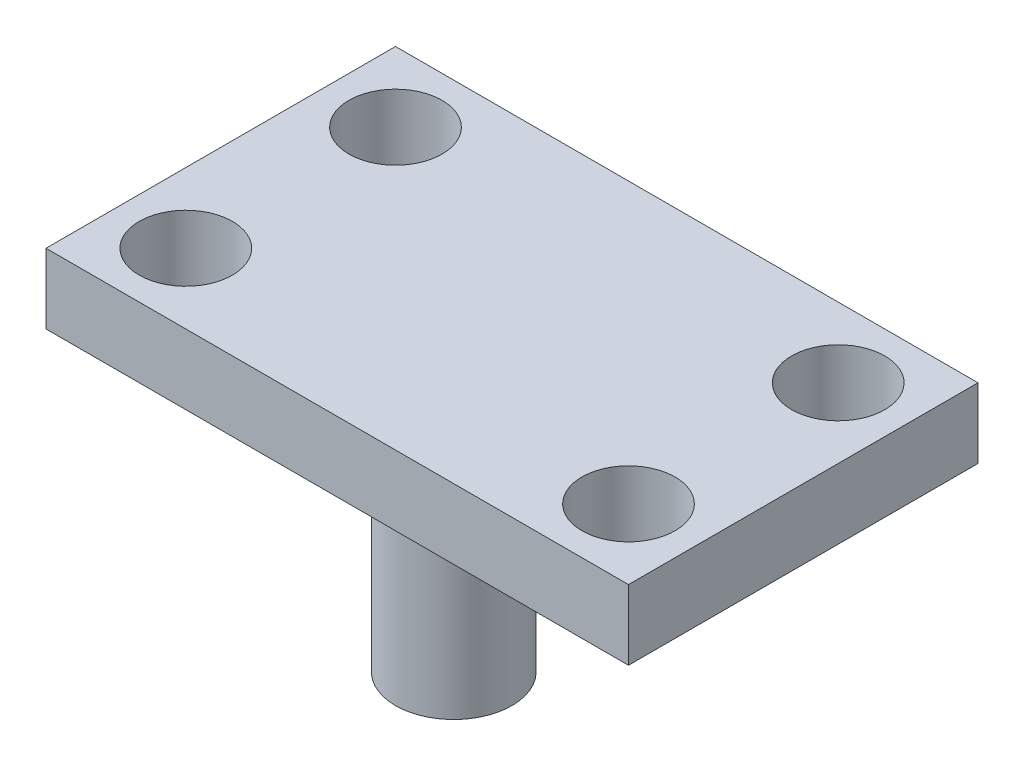
ISO-10303-21;
HEADER;
FILE_DESCRIPTION(('STEP AP214'),'2;1');
FILE_NAME('part.step','',(''),(''),'','','');
FILE_SCHEMA(('AUTOMOTIVE_DESIGN { 1 0 10303 214 1 1 1 1 }'));
ENDSEC;
DATA;
#1=APPLICATION_CONTEXT('core data for automotive mechanical design processes');
#2=APPLICATION_PROTOCOL_DEFINITION('international standard','automotive_design',2000,#1);
#3=PRODUCT_CONTEXT('',#1,'mechanical');
#4=PRODUCT('Part','Part','',(#3));
#5=PRODUCT_RELATED_PRODUCT_CATEGORY('part','',(#4));
#6=PRODUCT_DEFINITION_FORMATION('','',#4);
#7=PRODUCT_DEFINITION_CONTEXT('part definition',#1,'design');
#8=PRODUCT_DEFINITION('design','',#6,#7);
#9=PRODUCT_DEFINITION_SHAPE('','',#8);
#10=(LENGTH_UNIT() NAMED_UNIT(*) SI_UNIT(.MILLI.,.METRE.));
#11=(NAMED_UNIT(*) PLANE_ANGLE_UNIT() SI_UNIT($,.RADIAN.));
#12=(NAMED_UNIT(*) SI_UNIT($,.STERADIAN.) SOLID_ANGLE_UNIT());
#13=UNCERTAINTY_MEASURE_WITH_UNIT(LENGTH_MEASURE(1.E-05),#10,'distance_accuracy_value','');
#14=(GEOMETRIC_REPRESENTATION_CONTEXT(3) GLOBAL_UNCERTAINTY_ASSIGNED_CONTEXT((#13)) GLOBAL_UNIT_ASSIGNED_CONTEXT((#10,
#11,#12)) REPRESENTATION_CONTEXT('',''));
#15=CARTESIAN_POINT('',(0.,0.,0.));
#16=DIRECTION('',(0.,0.,1.));
#17=DIRECTION('',(1.,0.,0.));
#18=AXIS2_PLACEMENT_3D('',#15,#16,#17);
#19=CARTESIAN_POINT('',(0.,30.,0.));
#20=DIRECTION('',(0.,1.,0.));
#21=DIRECTION('',(0.,0.,1.));
#22=AXIS2_PLACEMENT_3D('',#19,#20,#21);
#23=PLANE('',#22);
#24=CARTESIAN_POINT('',(95.,30.,-45.));
#25=DIRECTION('',(0.,1.,0.));
#26=DIRECTION('',(0.,0.,1.));
#27=AXIS2_PLACEMENT_3D('',#24,#25,#26);
#28=CIRCLE('',#27,20.);
#29=CARTESIAN_POINT('',(95.,30.,-25.));
#30=VERTEX_POINT('',#29);
#31=EDGE_CURVE('E125',#30,#30,#28,.T.);
#32=ORIENTED_EDGE('',*,*,#31,.F.);
#33=EDGE_LOOP('',(#32));
#34=FACE_BOUND('',#33,.T.);
#35=CARTESIAN_POINT('',(-95.,30.,45.));
#36=DIRECTION('',(0.,1.,0.));
#37=DIRECTION('',(0.,0.,1.));
#38=AXIS2_PLACEMENT_3D('',#35,#36,#37);
#39=CIRCLE('',#38,20.);
#40=CARTESIAN_POINT('',(-95.,30.,65.));
#41=VERTEX_POINT('',#40);
#42=EDGE_CURVE('E104',#41,#41,#39,.T.);
#43=ORIENTED_EDGE('',*,*,#42,.F.);
#44=EDGE_LOOP('',(#43));
#45=FACE_BOUND('',#44,.T.);
#46=DIRECTION('',(0.,0.,-1.));
#47=VECTOR('',#46,1.);
#48=CARTESIAN_POINT('',(125.,30.,-75.));
#49=LINE('',#48,#47);
#50=CARTESIAN_POINT('',(125.,30.,75.));
#51=VERTEX_POINT('',#50);
#52=CARTESIAN_POINT('',(125.,30.,-75.));
#53=VERTEX_POINT('',#52);
#54=EDGE_CURVE('E89',#51,#53,#49,.T.);
#55=ORIENTED_EDGE('',*,*,#54,.T.);
#56=DIRECTION('',(-1.,0.,0.));
#57=VECTOR('',#56,1.);
#58=CARTESIAN_POINT('',(-125.,30.,-75.));
#59=LINE('',#58,#57);
#60=CARTESIAN_POINT('',(-125.,30.,-75.));
#61=VERTEX_POINT('',#60);
#62=EDGE_CURVE('E84',#53,#61,#59,.T.);
#63=ORIENTED_EDGE('',*,*,#62,.T.);
#64=DIRECTION('',(0.,0.,1.));
#65=VECTOR('',#64,1.);
#66=CARTESIAN_POINT('',(-125.,30.,-75.));
#67=LINE('',#66,#65);
#68=CARTESIAN_POINT('',(-125.,30.,75.));
#69=VERTEX_POINT('',#68);
#70=EDGE_CURVE('E87',#61,#69,#67,.T.);
#71=ORIENTED_EDGE('',*,*,#70,.T.);
#72=DIRECTION('',(1.,0.,0.));
#73=VECTOR('',#72,1.);
#74=CARTESIAN_POINT('',(-125.,30.,75.));
#75=LINE('',#74,#73);
#76=EDGE_CURVE('E54',#69,#51,#75,.T.);
#77=ORIENTED_EDGE('',*,*,#76,.T.);
#78=EDGE_LOOP('',(#55,#63,#71,#77));
#79=FACE_BOUND('',#78,.T.);
#80=CARTESIAN_POINT('',(-95.,30.,-45.));
#81=DIRECTION('',(0.,1.,0.));
#82=DIRECTION('',(0.,0.,1.));
#83=AXIS2_PLACEMENT_3D('',#80,#81,#82);
#84=CIRCLE('',#83,20.);
#85=CARTESIAN_POINT('',(-95.,30.,-25.));
#86=VERTEX_POINT('',#85);
#87=EDGE_CURVE('E119',#86,#86,#84,.T.);
#88=ORIENTED_EDGE('',*,*,#87,.F.);
#89=EDGE_LOOP('',(#88));
#90=FACE_BOUND('',#89,.T.);
#91=CARTESIAN_POINT('',(95.,30.,45.));
#92=DIRECTION('',(0.,1.,0.));
#93=DIRECTION('',(0.,0.,1.));
#94=AXIS2_PLACEMENT_3D('',#91,#92,#93);
#95=CIRCLE('',#94,20.);
#96=CARTESIAN_POINT('',(95.,30.,65.));
#97=VERTEX_POINT('',#96);
#98=EDGE_CURVE('E131',#97,#97,#95,.T.);
#99=ORIENTED_EDGE('',*,*,#98,.F.);
#100=EDGE_LOOP('',(#99));
#101=FACE_BOUND('',#100,.T.);
#102=ADVANCED_FACE('F37',(#34,#45,#79,#90,#101),#23,.T.);
#103=CARTESIAN_POINT('',(0.,0.,0.));
#104=DIRECTION('',(0.,1.,0.));
#105=DIRECTION('',(0.,0.,1.));
#106=AXIS2_PLACEMENT_3D('',#103,#104,#105);
#107=PLANE('',#106);
#108=CARTESIAN_POINT('',(0.,0.,25.));
#109=DIRECTION('',(0.,1.,0.));
#110=DIRECTION('',(0.,0.,1.));
#111=AXIS2_PLACEMENT_3D('',#108,#109,#110);
#112=CIRCLE('',#111,25.);
#113=CARTESIAN_POINT('',(0.,0.,50.));
#114=VERTEX_POINT('',#113);
#115=EDGE_CURVE('E140',#114,#114,#112,.T.);
#116=ORIENTED_EDGE('',*,*,#115,.T.);
#117=EDGE_LOOP('',(#116));
#118=FACE_BOUND('',#117,.T.);
#119=DIRECTION('',(0.,0.,-1.));
#120=VECTOR('',#119,1.);
#121=CARTESIAN_POINT('',(125.,0.,-75.));
#122=LINE('',#121,#120);
#123=CARTESIAN_POINT('',(125.,0.,75.));
#124=VERTEX_POINT('',#123);
#125=CARTESIAN_POINT('',(125.,0.,-75.));
#126=VERTEX_POINT('',#125);
#127=EDGE_CURVE('E101',#124,#126,#122,.T.);
#128=ORIENTED_EDGE('',*,*,#127,.F.);
#129=DIRECTION('',(1.,0.,0.));
#130=VECTOR('',#129,1.);
#131=CARTESIAN_POINT('',(-125.,0.,75.));
#132=LINE('',#131,#130);
#133=CARTESIAN_POINT('',(-125.,0.,75.));
#134=VERTEX_POINT('',#133);
#135=EDGE_CURVE('E77',#134,#124,#132,.T.);
#136=ORIENTED_EDGE('',*,*,#135,.F.);
#137=DIRECTION('',(0.,0.,1.));
#138=VECTOR('',#137,1.);
#139=CARTESIAN_POINT('',(-125.,0.,-75.));
#140=LINE('',#139,#138);
#141=CARTESIAN_POINT('',(-125.,0.,-75.));
#142=VERTEX_POINT('',#141);
#143=EDGE_CURVE('E71',#142,#134,#140,.T.);
#144=ORIENTED_EDGE('',*,*,#143,.F.);
#145=DIRECTION('',(-1.,0.,0.));
#146=VECTOR('',#145,1.);
#147=CARTESIAN_POINT('',(-125.,0.,-75.));
#148=LINE('',#147,#146);
#149=EDGE_CURVE('E93',#126,#142,#148,.T.);
#150=ORIENTED_EDGE('',*,*,#149,.F.);
#151=EDGE_LOOP('',(#128,#136,#144,#150));
#152=FACE_BOUND('',#151,.T.);
#153=CARTESIAN_POINT('',(-95.,0.,45.));
#154=DIRECTION('',(0.,1.,0.));
#155=DIRECTION('',(0.,0.,1.));
#156=AXIS2_PLACEMENT_3D('',#153,#154,#155);
#157=CIRCLE('',#156,20.);
#158=CARTESIAN_POINT('',(-95.,0.,65.));
#159=VERTEX_POINT('',#158);
#160=EDGE_CURVE('E116',#159,#159,#157,.T.);
#161=ORIENTED_EDGE('',*,*,#160,.T.);
#162=EDGE_LOOP('',(#161));
#163=FACE_BOUND('',#162,.T.);
#164=CARTESIAN_POINT('',(-95.,0.,-45.));
#165=DIRECTION('',(0.,1.,0.));
#166=DIRECTION('',(0.,0.,1.));
#167=AXIS2_PLACEMENT_3D('',#164,#165,#166);
#168=CIRCLE('',#167,20.);
#169=CARTESIAN_POINT('',(-95.,0.,-25.));
#170=VERTEX_POINT('',#169);
#171=EDGE_CURVE('E122',#170,#170,#168,.T.);
#172=ORIENTED_EDGE('',*,*,#171,.T.);
#173=EDGE_LOOP('',(#172));
#174=FACE_BOUND('',#173,.T.);
#175=CARTESIAN_POINT('',(95.,0.,-45.));
#176=DIRECTION('',(0.,1.,0.));
#177=DIRECTION('',(0.,0.,1.));
#178=AXIS2_PLACEMENT_3D('',#175,#176,#177);
#179=CIRCLE('',#178,20.);
#180=CARTESIAN_POINT('',(95.,0.,-25.));
#181=VERTEX_POINT('',#180);
#182=EDGE_CURVE('E128',#181,#181,#179,.T.);
#183=ORIENTED_EDGE('',*,*,#182,.T.);
#184=EDGE_LOOP('',(#183));
#185=FACE_BOUND('',#184,.T.);
#186=CARTESIAN_POINT('',(95.,0.,45.));
#187=DIRECTION('',(0.,1.,0.));
#188=DIRECTION('',(0.,0.,1.));
#189=AXIS2_PLACEMENT_3D('',#186,#187,#188);
#190=CIRCLE('',#189,20.);
#191=CARTESIAN_POINT('',(95.,0.,65.));
#192=VERTEX_POINT('',#191);
#193=EDGE_CURVE('E134',#192,#192,#190,.T.);
#194=ORIENTED_EDGE('',*,*,#193,.T.);
#195=EDGE_LOOP('',(#194));
#196=FACE_BOUND('',#195,.T.);
#197=ADVANCED_FACE('F112',(#118,#152,#163,#174,#185,#196),#107,.F.);
#198=CARTESIAN_POINT('',(125.,30.,-75.));
#199=DIRECTION('',(-1.,0.,0.));
#200=DIRECTION('',(0.,0.,1.));
#201=AXIS2_PLACEMENT_3D('',#198,#199,#200);
#202=PLANE('',#201);
#203=ORIENTED_EDGE('',*,*,#127,.T.);
#204=DIRECTION('',(0.,-1.,0.));
#205=VECTOR('',#204,1.);
#206=CARTESIAN_POINT('',(125.,30.,-75.));
#207=LINE('',#206,#205);
#208=EDGE_CURVE('E11',#53,#126,#207,.T.);
#209=ORIENTED_EDGE('',*,*,#208,.F.);
#210=ORIENTED_EDGE('',*,*,#54,.F.);
#211=DIRECTION('',(0.,-1.,0.));
#212=VECTOR('',#211,1.);
#213=CARTESIAN_POINT('',(125.,30.,75.));
#214=LINE('',#213,#212);
#215=EDGE_CURVE('E97',#51,#124,#214,.T.);
#216=ORIENTED_EDGE('',*,*,#215,.T.);
#217=EDGE_LOOP('',(#203,#209,#210,#216));
#218=FACE_BOUND('',#217,.T.);
#219=ADVANCED_FACE('F39',(#218),#202,.F.);
#220=CARTESIAN_POINT('',(-125.,30.,-75.));
#221=DIRECTION('',(0.,0.,1.));
#222=DIRECTION('',(1.,0.,0.));
#223=AXIS2_PLACEMENT_3D('',#220,#221,#222);
#224=PLANE('',#223);
#225=ORIENTED_EDGE('',*,*,#149,.T.);
#226=DIRECTION('',(0.,-1.,0.));
#227=VECTOR('',#226,1.);
#228=CARTESIAN_POINT('',(-125.,30.,-75.));
#229=LINE('',#228,#227);
#230=EDGE_CURVE('E46',#61,#142,#229,.T.);
#231=ORIENTED_EDGE('',*,*,#230,.F.);
#232=ORIENTED_EDGE('',*,*,#62,.F.);
#233=ORIENTED_EDGE('',*,*,#208,.T.);
#234=EDGE_LOOP('',(#225,#231,#232,#233));
#235=FACE_BOUND('',#234,.T.);
#236=ADVANCED_FACE('F92',(#235),#224,.F.);
#237=CARTESIAN_POINT('',(-125.,30.,-75.));
#238=DIRECTION('',(1.,0.,0.));
#239=DIRECTION('',(0.,0.,-1.));
#240=AXIS2_PLACEMENT_3D('',#237,#238,#239);
#241=PLANE('',#240);
#242=ORIENTED_EDGE('',*,*,#143,.T.);
#243=DIRECTION('',(0.,-1.,0.));
#244=VECTOR('',#243,1.);
#245=CARTESIAN_POINT('',(-125.,30.,75.));
#246=LINE('',#245,#244);
#247=EDGE_CURVE('E94',#69,#134,#246,.T.);
#248=ORIENTED_EDGE('',*,*,#247,.F.);
#249=ORIENTED_EDGE('',*,*,#70,.F.);
#250=ORIENTED_EDGE('',*,*,#230,.T.);
#251=EDGE_LOOP('',(#242,#248,#249,#250));
#252=FACE_BOUND('',#251,.T.);
#253=ADVANCED_FACE('F95',(#252),#241,.F.);
#254=CARTESIAN_POINT('',(-125.,30.,75.));
#255=DIRECTION('',(0.,0.,-1.));
#256=DIRECTION('',(-1.,0.,0.));
#257=AXIS2_PLACEMENT_3D('',#254,#255,#256);
#258=PLANE('',#257);
#259=ORIENTED_EDGE('',*,*,#135,.T.);
#260=ORIENTED_EDGE('',*,*,#215,.F.);
#261=ORIENTED_EDGE('',*,*,#76,.F.);
#262=ORIENTED_EDGE('',*,*,#247,.T.);
#263=EDGE_LOOP('',(#259,#260,#261,#262));
#264=FACE_BOUND('',#263,.T.);
#265=ADVANCED_FACE('F109',(#264),#258,.F.);
#266=CARTESIAN_POINT('',(-95.,30.,45.));
#267=DIRECTION('',(0.,-1.,0.));
#268=DIRECTION('',(0.,0.,-1.));
#269=AXIS2_PLACEMENT_3D('',#266,#267,#268);
#270=CYLINDRICAL_SURFACE('',#269,20.);
#271=ORIENTED_EDGE('',*,*,#42,.T.);
#272=EDGE_LOOP('',(#271));
#273=FACE_BOUND('',#272,.T.);
#274=ORIENTED_EDGE('',*,*,#160,.F.);
#275=EDGE_LOOP('',(#274));
#276=FACE_BOUND('',#275,.T.);
#277=ADVANCED_FACE('F168',(#273,#276),#270,.F.);
#278=CARTESIAN_POINT('',(-95.,30.,-45.));
#279=DIRECTION('',(0.,-1.,0.));
#280=DIRECTION('',(0.,0.,-1.));
#281=AXIS2_PLACEMENT_3D('',#278,#279,#280);
#282=CYLINDRICAL_SURFACE('',#281,20.);
#283=ORIENTED_EDGE('',*,*,#87,.T.);
#284=EDGE_LOOP('',(#283));
#285=FACE_BOUND('',#284,.T.);
#286=ORIENTED_EDGE('',*,*,#171,.F.);
#287=EDGE_LOOP('',(#286));
#288=FACE_BOUND('',#287,.T.);
#289=ADVANCED_FACE('F220',(#285,#288),#282,.F.);
#290=CARTESIAN_POINT('',(95.,30.,-45.));
#291=DIRECTION('',(0.,-1.,0.));
#292=DIRECTION('',(0.,0.,-1.));
#293=AXIS2_PLACEMENT_3D('',#290,#291,#292);
#294=CYLINDRICAL_SURFACE('',#293,20.);
#295=ORIENTED_EDGE('',*,*,#31,.T.);
#296=EDGE_LOOP('',(#295));
#297=FACE_BOUND('',#296,.T.);
#298=ORIENTED_EDGE('',*,*,#182,.F.);
#299=EDGE_LOOP('',(#298));
#300=FACE_BOUND('',#299,.T.);
#301=ADVANCED_FACE('F211',(#297,#300),#294,.F.);
#302=CARTESIAN_POINT('',(95.,30.,45.));
#303=DIRECTION('',(0.,-1.,0.));
#304=DIRECTION('',(0.,0.,-1.));
#305=AXIS2_PLACEMENT_3D('',#302,#303,#304);
#306=CYLINDRICAL_SURFACE('',#305,20.);
#307=ORIENTED_EDGE('',*,*,#98,.T.);
#308=EDGE_LOOP('',(#307));
#309=FACE_BOUND('',#308,.T.);
#310=ORIENTED_EDGE('',*,*,#193,.F.);
#311=EDGE_LOOP('',(#310));
#312=FACE_BOUND('',#311,.T.);
#313=ADVANCED_FACE('F155',(#309,#312),#306,.F.);
#314=CARTESIAN_POINT('',(0.,-90.,25.));
#315=DIRECTION('',(0.,1.,0.));
#316=DIRECTION('',(0.,0.,1.));
#317=AXIS2_PLACEMENT_3D('',#314,#315,#316);
#318=CYLINDRICAL_SURFACE('',#317,25.);
#319=CARTESIAN_POINT('',(0.,-90.,25.));
#320=DIRECTION('',(0.,1.,0.));
#321=DIRECTION('',(0.,0.,1.));
#322=AXIS2_PLACEMENT_3D('',#319,#320,#321);
#323=CIRCLE('',#322,25.);
#324=CARTESIAN_POINT('',(0.,-90.,50.));
#325=VERTEX_POINT('',#324);
#326=EDGE_CURVE('E137',#325,#325,#323,.T.);
#327=CARTESIAN_POINT('',(0.,-90.,50.));
#328=CARTESIAN_POINT('',(0.,-89.0625,50.));
#329=CARTESIAN_POINT('',(0.,-88.125,50.));
#330=CARTESIAN_POINT('',(0.,-86.25,50.));
#331=CARTESIAN_POINT('',(0.,-85.3125,50.));
#332=CARTESIAN_POINT('',(0.,-83.4375,50.));
#333=CARTESIAN_POINT('',(0.,-82.5,50.));
#334=CARTESIAN_POINT('',(0.,-80.625,50.));
#335=CARTESIAN_POINT('',(0.,-79.6875,50.));
#336=CARTESIAN_POINT('',(0.,-77.8125,50.));
#337=CARTESIAN_POINT('',(0.,-76.875,50.));
#338=CARTESIAN_POINT('',(0.,-75.,50.));
#339=CARTESIAN_POINT('',(0.,-74.0625,50.));
#340=CARTESIAN_POINT('',(0.,-72.1875,50.));
#341=CARTESIAN_POINT('',(0.,-71.25,50.));
#342=CARTESIAN_POINT('',(0.,-69.375,50.));
#343=CARTESIAN_POINT('',(0.,-68.4375,50.));
#344=CARTESIAN_POINT('',(0.,-66.5625,50.));
#345=CARTESIAN_POINT('',(0.,-65.625,50.));
#346=CARTESIAN_POINT('',(0.,-63.75,50.));
#347=CARTESIAN_POINT('',(0.,-62.8125,50.));
#348=CARTESIAN_POINT('',(0.,-60.9375,50.));
#349=CARTESIAN_POINT('',(0.,-60.,50.));
#350=CARTESIAN_POINT('',(0.,-58.125,50.));
#351=CARTESIAN_POINT('',(0.,-57.1875,50.));
#352=CARTESIAN_POINT('',(0.,-55.3125,50.));
#353=CARTESIAN_POINT('',(0.,-54.375,50.));
#354=CARTESIAN_POINT('',(0.,-52.5,50.));
#355=CARTESIAN_POINT('',(0.,-51.5625,50.));
#356=CARTESIAN_POINT('',(0.,-49.6875,50.));
#357=CARTESIAN_POINT('',(0.,-48.75,50.));
#358=CARTESIAN_POINT('',(0.,-46.875,50.));
#359=CARTESIAN_POINT('',(0.,-45.9375,50.));
#360=CARTESIAN_POINT('',(0.,-44.0625,50.));
#361=CARTESIAN_POINT('',(0.,-43.125,50.));
#362=CARTESIAN_POINT('',(0.,-41.25,50.));
#363=CARTESIAN_POINT('',(0.,-40.3125,50.));
#364=CARTESIAN_POINT('',(0.,-38.4375,50.));
#365=CARTESIAN_POINT('',(0.,-37.5,50.));
#366=CARTESIAN_POINT('',(0.,-35.625,50.));
#367=CARTESIAN_POINT('',(0.,-34.6875,50.));
#368=CARTESIAN_POINT('',(0.,-32.8125,50.));
#369=CARTESIAN_POINT('',(0.,-31.875,50.));
#370=CARTESIAN_POINT('',(0.,-30.,50.));
#371=CARTESIAN_POINT('',(0.,-29.0625,50.));
#372=CARTESIAN_POINT('',(0.,-27.1875,50.));
#373=CARTESIAN_POINT('',(0.,-26.25,50.));
#374=CARTESIAN_POINT('',(0.,-24.375,50.));
#375=CARTESIAN_POINT('',(0.,-23.4375,50.));
#376=CARTESIAN_POINT('',(0.,-21.5625,50.));
#377=CARTESIAN_POINT('',(0.,-20.625,50.));
#378=CARTESIAN_POINT('',(0.,-18.75,50.));
#379=CARTESIAN_POINT('',(0.,-17.8125,50.));
#380=CARTESIAN_POINT('',(0.,-15.9375,50.));
#381=CARTESIAN_POINT('',(0.,-15.,50.));
#382=CARTESIAN_POINT('',(0.,-13.125,50.));
#383=CARTESIAN_POINT('',(0.,-12.1875,50.));
#384=CARTESIAN_POINT('',(0.,-10.3125,50.));
#385=CARTESIAN_POINT('',(0.,-9.37500000000001,50.));
#386=CARTESIAN_POINT('',(0.,-7.50000000000002,50.));
#387=CARTESIAN_POINT('',(0.,-6.56250000000002,50.));
#388=CARTESIAN_POINT('',(0.,-4.68750000000002,50.));
#389=CARTESIAN_POINT('',(0.,-3.75000000000001,50.));
#390=CARTESIAN_POINT('',(0.,-1.87500000000001,50.));
#391=CARTESIAN_POINT('',(0.,-0.937500000000014,50.));
#392=CARTESIAN_POINT('',(0.,0.,50.));
#393=B_SPLINE_CURVE_WITH_KNOTS('',3,(#327,#328,#329,#330,#331,#332,#333,#334,#335,#336,#337,
#338,#339,#340,#341,#342,#343,#344,#345,#346,#347,#348,#349,#350,#351,#352,#353,#354,#355,#356,
#357,#358,#359,#360,#361,#362,#363,#364,#365,#366,#367,#368,#369,#370,#371,#372,#373,#374,#375,
#376,#377,#378,#379,#380,#381,#382,#383,#384,#385,#386,#387,#388,#389,#390,#391,#392),
.UNSPECIFIED.,.F.,.F.,(4,2,2,2,2,2,2,2,2,2,2,2,2,2,2,2,2,2,2,2,2,2,2,2,2,2,2,2,2,2,2,2,4),(0.,
2.81250000000001,5.62500000000001,8.4375,11.25,14.0625,16.875,19.6875,22.5,25.3125,28.125,
30.9375,33.75,36.5625,39.375,42.1875,45.,47.8125,50.625,53.4375,56.25,59.0625,61.875,64.6875,
67.5,70.3125,73.125,75.9375,78.75,81.5625,84.375,87.1875,90.),.UNSPECIFIED.);
#394=EDGE_CURVE('BSEAM146',#325,#114,#393,.T.);
#395=ORIENTED_EDGE('',*,*,#326,.T.);
#396=ORIENTED_EDGE('',*,*,#115,.F.);
#397=ORIENTED_EDGE('',*,*,#394,.T.);
#398=ORIENTED_EDGE('',*,*,#394,.F.);
#399=EDGE_LOOP('',(#395,#397,#396,#398));
#400=FACE_BOUND('',#399,.T.);
#401=ADVANCED_FACE('F146',(#400),#318,.T.);
#402=CARTESIAN_POINT('',(0.,-90.,25.));
#403=DIRECTION('',(0.,1.,0.));
#404=DIRECTION('',(0.,0.,1.));
#405=AXIS2_PLACEMENT_3D('',#402,#403,#404);
#406=PLANE('',#405);
#407=ORIENTED_EDGE('',*,*,#326,.F.);
#408=EDGE_LOOP('',(#407));
#409=FACE_BOUND('',#408,.T.);
#410=ADVANCED_FACE('F149',(#409),#406,.F.);
#411=CLOSED_SHELL('',(#102,#197,#219,#236,#253,#265,#277,#289,#301,#313,#401,#410));
#412=MANIFOLD_SOLID_BREP('B2',#411);
#413=ADVANCED_BREP_SHAPE_REPRESENTATION('',(#18,#412),#14);
#414=SHAPE_DEFINITION_REPRESENTATION(#9,#413);
ENDSEC;
END-ISO-10303-21;
